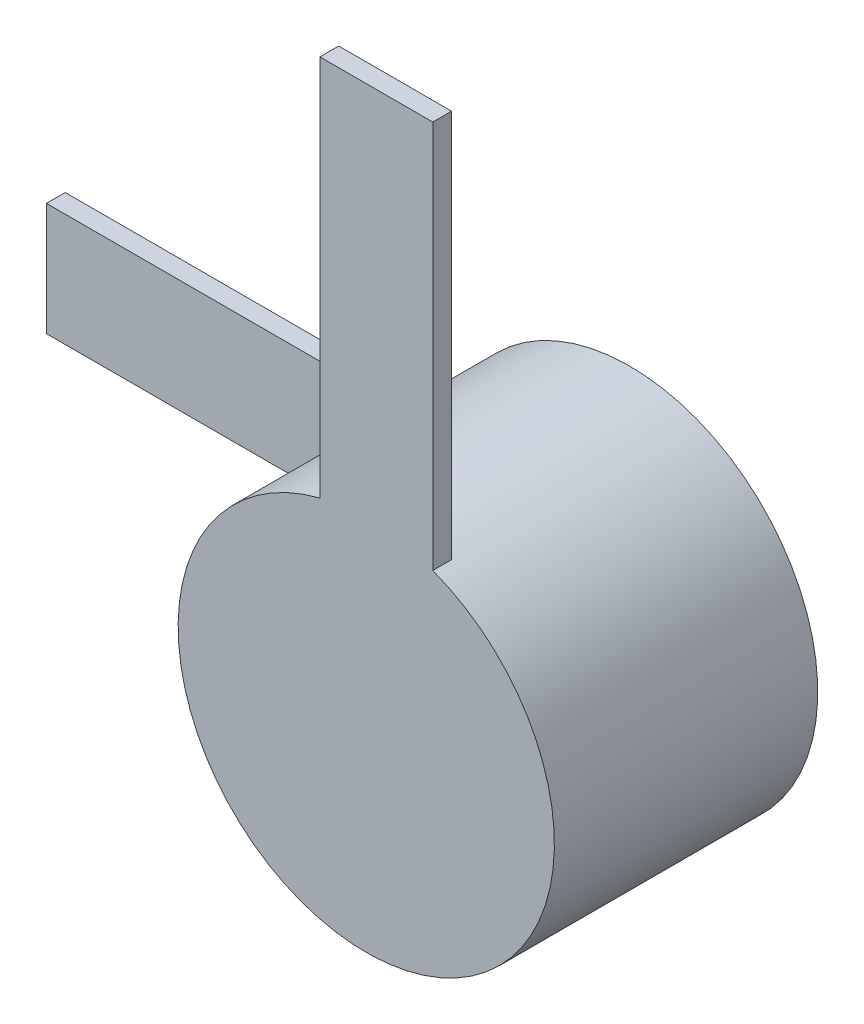
ISO-10303-21;
HEADER;
FILE_DESCRIPTION(('STEP AP214'),'2;1');
FILE_NAME('part.step','',(''),(''),'','','');
FILE_SCHEMA(('AUTOMOTIVE_DESIGN { 1 0 10303 214 1 1 1 1 }'));
ENDSEC;
DATA;
#1=APPLICATION_CONTEXT('core data for automotive mechanical design processes');
#2=APPLICATION_PROTOCOL_DEFINITION('international standard','automotive_design',2000,#1);
#3=PRODUCT_CONTEXT('',#1,'mechanical');
#4=PRODUCT('Part','Part','',(#3));
#5=PRODUCT_RELATED_PRODUCT_CATEGORY('part','',(#4));
#6=PRODUCT_DEFINITION_FORMATION('','',#4);
#7=PRODUCT_DEFINITION_CONTEXT('part definition',#1,'design');
#8=PRODUCT_DEFINITION('design','',#6,#7);
#9=PRODUCT_DEFINITION_SHAPE('','',#8);
#10=(LENGTH_UNIT() NAMED_UNIT(*) SI_UNIT(.MILLI.,.METRE.));
#11=(NAMED_UNIT(*) PLANE_ANGLE_UNIT() SI_UNIT($,.RADIAN.));
#12=(NAMED_UNIT(*) SI_UNIT($,.STERADIAN.) SOLID_ANGLE_UNIT());
#13=UNCERTAINTY_MEASURE_WITH_UNIT(LENGTH_MEASURE(1.E-05),#10,'distance_accuracy_value','');
#14=(GEOMETRIC_REPRESENTATION_CONTEXT(3) GLOBAL_UNCERTAINTY_ASSIGNED_CONTEXT((#13)) GLOBAL_UNIT_ASSIGNED_CONTEXT((#10,
#11,#12)) REPRESENTATION_CONTEXT('',''));
#15=CARTESIAN_POINT('',(0.,0.,0.));
#16=DIRECTION('',(0.,0.,1.));
#17=DIRECTION('',(1.,0.,0.));
#18=AXIS2_PLACEMENT_3D('',#15,#16,#17);
#19=CARTESIAN_POINT('',(0.,0.,70.));
#20=DIRECTION('',(0.,0.,-1.));
#21=DIRECTION('',(-1.,0.,0.));
#22=AXIS2_PLACEMENT_3D('',#19,#20,#21);
#23=CYLINDRICAL_SURFACE('',#22,50.);
#24=CARTESIAN_POINT('',(0.,0.,5.));
#25=DIRECTION('',(0.,0.,1.));
#26=DIRECTION('',(0.,-1.,0.));
#27=AXIS2_PLACEMENT_3D('',#24,#25,#26);
#28=CIRCLE('',#27,50.);
#29=CARTESIAN_POINT('',(-47.7157659315328,14.9400696640668,5.));
#30=VERTEX_POINT('',#29);
#31=CARTESIAN_POINT('',(-47.678071461384,-15.0599303359332,5.));
#32=VERTEX_POINT('',#31);
#33=EDGE_CURVE('E11',#30,#32,#28,.T.);
#34=ORIENTED_EDGE('',*,*,#33,.T.);
#35=DIRECTION('',(0.,0.,-1.));
#36=VECTOR('',#35,1.);
#37=CARTESIAN_POINT('',(-47.678071461384,-15.0599303359332,70.));
#38=LINE('',#37,#36);
#39=CARTESIAN_POINT('',(-47.678071461384,-15.0599303359332,0.));
#40=VERTEX_POINT('',#39);
#41=EDGE_CURVE('E134',#32,#40,#38,.T.);
#42=ORIENTED_EDGE('',*,*,#41,.T.);
#43=CARTESIAN_POINT('',(0.,0.,0.));
#44=DIRECTION('',(0.,0.,1.));
#45=DIRECTION('',(1.,0.,0.));
#46=AXIS2_PLACEMENT_3D('',#43,#44,#45);
#47=CIRCLE('',#46,50.);
#48=CARTESIAN_POINT('',(-47.7157659315328,14.9400696640668,0.));
#49=VERTEX_POINT('',#48);
#50=EDGE_CURVE('E163',#40,#49,#47,.T.);
#51=ORIENTED_EDGE('',*,*,#50,.T.);
#52=DIRECTION('',(0.,0.,-1.));
#53=VECTOR('',#52,1.);
#54=CARTESIAN_POINT('',(-47.7157659315328,14.9400696640668,70.));
#55=LINE('',#54,#53);
#56=EDGE_CURVE('E105',#49,#30,#55,.F.);
#57=ORIENTED_EDGE('',*,*,#56,.T.);
#58=EDGE_LOOP('',(#34,#42,#51,#57));
#59=FACE_BOUND('',#58,.T.);
#60=DIRECTION('',(0.,0.,-1.));
#61=VECTOR('',#60,1.);
#62=CARTESIAN_POINT('',(-12.3266957170573,48.4567082321848,70.));
#63=LINE('',#62,#61);
#64=CARTESIAN_POINT('',(-12.3266957170573,48.4567082321848,65.));
#65=VERTEX_POINT('',#64);
#66=CARTESIAN_POINT('',(-12.3266957170573,48.4567082321848,70.));
#67=VERTEX_POINT('',#66);
#68=EDGE_CURVE('E160',#65,#67,#63,.F.);
#69=ORIENTED_EDGE('',*,*,#68,.F.);
#70=CARTESIAN_POINT('',(0.,0.,65.));
#71=DIRECTION('',(0.,0.,1.));
#72=DIRECTION('',(1.,0.,0.));
#73=AXIS2_PLACEMENT_3D('',#70,#71,#72);
#74=CIRCLE('',#73,50.);
#75=CARTESIAN_POINT('',(17.6733042829427,46.7723670100468,65.));
#76=VERTEX_POINT('',#75);
#77=EDGE_CURVE('E46',#76,#65,#74,.T.);
#78=ORIENTED_EDGE('',*,*,#77,.F.);
#79=DIRECTION('',(0.,0.,-1.));
#80=VECTOR('',#79,1.);
#81=CARTESIAN_POINT('',(17.6733042829427,46.7723670100468,70.));
#82=LINE('',#81,#80);
#83=CARTESIAN_POINT('',(17.6733042829427,46.7723670100468,70.));
#84=VERTEX_POINT('',#83);
#85=EDGE_CURVE('E158',#84,#76,#82,.T.);
#86=ORIENTED_EDGE('',*,*,#85,.F.);
#87=CARTESIAN_POINT('',(0.,0.,70.));
#88=DIRECTION('',(0.,0.,1.));
#89=DIRECTION('',(1.,0.,0.));
#90=AXIS2_PLACEMENT_3D('',#87,#88,#89);
#91=CIRCLE('',#90,50.);
#92=EDGE_CURVE('E164',#67,#84,#91,.T.);
#93=ORIENTED_EDGE('',*,*,#92,.F.);
#94=EDGE_LOOP('',(#69,#78,#86,#93));
#95=FACE_BOUND('',#94,.T.);
#96=ADVANCED_FACE('F39',(#59,#95),#23,.T.);
#97=CARTESIAN_POINT('',(0.,0.,70.));
#98=DIRECTION('',(0.,0.,1.));
#99=DIRECTION('',(1.,0.,0.));
#100=AXIS2_PLACEMENT_3D('',#97,#98,#99);
#101=PLANE('',#100);
#102=ORIENTED_EDGE('',*,*,#92,.T.);
#103=DIRECTION('',(0.,-1.,0.));
#104=VECTOR('',#103,1.);
#105=CARTESIAN_POINT('',(17.6733042829427,150.,70.));
#106=LINE('',#105,#104);
#107=CARTESIAN_POINT('',(17.6733042829427,150.,70.));
#108=VERTEX_POINT('',#107);
#109=EDGE_CURVE('E152',#108,#84,#106,.T.);
#110=ORIENTED_EDGE('',*,*,#109,.F.);
#111=DIRECTION('',(1.,0.,0.));
#112=VECTOR('',#111,1.);
#113=CARTESIAN_POINT('',(-12.3266957170573,150.,70.));
#114=LINE('',#113,#112);
#115=CARTESIAN_POINT('',(-12.3266957170573,150.,70.));
#116=VERTEX_POINT('',#115);
#117=EDGE_CURVE('E140',#116,#108,#114,.T.);
#118=ORIENTED_EDGE('',*,*,#117,.F.);
#119=DIRECTION('',(0.,-1.,0.));
#120=VECTOR('',#119,1.);
#121=CARTESIAN_POINT('',(-12.3266957170573,150.,70.));
#122=LINE('',#121,#120);
#123=EDGE_CURVE('E155',#116,#67,#122,.T.);
#124=ORIENTED_EDGE('',*,*,#123,.T.);
#125=EDGE_LOOP('',(#102,#110,#118,#124));
#126=FACE_BOUND('',#125,.T.);
#127=ADVANCED_FACE('F183',(#126),#101,.T.);
#128=CARTESIAN_POINT('',(0.,0.,0.));
#129=DIRECTION('',(0.,0.,1.));
#130=DIRECTION('',(1.,0.,0.));
#131=AXIS2_PLACEMENT_3D('',#128,#129,#130);
#132=PLANE('',#131);
#133=ORIENTED_EDGE('',*,*,#50,.F.);
#134=DIRECTION('',(1.,0.,0.));
#135=VECTOR('',#134,1.);
#136=CARTESIAN_POINT('',(-150.,-15.0599303359332,0.));
#137=LINE('',#136,#135);
#138=CARTESIAN_POINT('',(-150.,-15.0599303359332,0.));
#139=VERTEX_POINT('',#138);
#140=EDGE_CURVE('E123',#139,#40,#137,.T.);
#141=ORIENTED_EDGE('',*,*,#140,.F.);
#142=DIRECTION('',(0.,1.,0.));
#143=VECTOR('',#142,1.);
#144=CARTESIAN_POINT('',(-150.,14.9400696640668,0.));
#145=LINE('',#144,#143);
#146=CARTESIAN_POINT('',(-150.,14.9400696640668,0.));
#147=VERTEX_POINT('',#146);
#148=EDGE_CURVE('E117',#139,#147,#145,.T.);
#149=ORIENTED_EDGE('',*,*,#148,.T.);
#150=DIRECTION('',(1.,0.,0.));
#151=VECTOR('',#150,1.);
#152=CARTESIAN_POINT('',(-150.,14.9400696640668,0.));
#153=LINE('',#152,#151);
#154=EDGE_CURVE('E100',#147,#49,#153,.T.);
#155=ORIENTED_EDGE('',*,*,#154,.T.);
#156=EDGE_LOOP('',(#133,#141,#149,#155));
#157=FACE_BOUND('',#156,.T.);
#158=ADVANCED_FACE('F122',(#157),#132,.F.);
#159=CARTESIAN_POINT('',(-12.3266957170573,150.,70.));
#160=DIRECTION('',(1.,0.,0.));
#161=DIRECTION('',(0.,0.,-1.));
#162=AXIS2_PLACEMENT_3D('',#159,#160,#161);
#163=PLANE('',#162);
#164=DIRECTION('',(0.,-1.,0.));
#165=VECTOR('',#164,1.);
#166=CARTESIAN_POINT('',(-12.3266957170573,150.,65.));
#167=LINE('',#166,#165);
#168=CARTESIAN_POINT('',(-12.3266957170573,150.,65.));
#169=VERTEX_POINT('',#168);
#170=EDGE_CURVE('E146',#169,#65,#167,.T.);
#171=ORIENTED_EDGE('',*,*,#170,.T.);
#172=ORIENTED_EDGE('',*,*,#68,.T.);
#173=ORIENTED_EDGE('',*,*,#123,.F.);
#174=DIRECTION('',(0.,0.,1.));
#175=VECTOR('',#174,1.);
#176=CARTESIAN_POINT('',(-12.3266957170573,150.,70.));
#177=LINE('',#176,#175);
#178=EDGE_CURVE('E137',#169,#116,#177,.T.);
#179=ORIENTED_EDGE('',*,*,#178,.F.);
#180=EDGE_LOOP('',(#171,#172,#173,#179));
#181=FACE_BOUND('',#180,.T.);
#182=ADVANCED_FACE('F174',(#181),#163,.F.);
#183=CARTESIAN_POINT('',(17.6733042829427,150.,70.));
#184=DIRECTION('',(-1.,0.,0.));
#185=DIRECTION('',(0.,0.,1.));
#186=AXIS2_PLACEMENT_3D('',#183,#184,#185);
#187=PLANE('',#186);
#188=ORIENTED_EDGE('',*,*,#109,.T.);
#189=ORIENTED_EDGE('',*,*,#85,.T.);
#190=DIRECTION('',(0.,-1.,0.));
#191=VECTOR('',#190,1.);
#192=CARTESIAN_POINT('',(17.6733042829427,150.,65.));
#193=LINE('',#192,#191);
#194=CARTESIAN_POINT('',(17.6733042829427,150.,65.));
#195=VERTEX_POINT('',#194);
#196=EDGE_CURVE('E149',#195,#76,#193,.T.);
#197=ORIENTED_EDGE('',*,*,#196,.F.);
#198=DIRECTION('',(0.,0.,-1.));
#199=VECTOR('',#198,1.);
#200=CARTESIAN_POINT('',(17.6733042829427,150.,70.));
#201=LINE('',#200,#199);
#202=EDGE_CURVE('E142',#108,#195,#201,.T.);
#203=ORIENTED_EDGE('',*,*,#202,.F.);
#204=EDGE_LOOP('',(#188,#189,#197,#203));
#205=FACE_BOUND('',#204,.T.);
#206=ADVANCED_FACE('F181',(#205),#187,.F.);
#207=CARTESIAN_POINT('',(-12.3266957170573,150.,65.));
#208=DIRECTION('',(0.,0.,1.));
#209=DIRECTION('',(1.,0.,0.));
#210=AXIS2_PLACEMENT_3D('',#207,#208,#209);
#211=PLANE('',#210);
#212=ORIENTED_EDGE('',*,*,#196,.T.);
#213=ORIENTED_EDGE('',*,*,#77,.T.);
#214=ORIENTED_EDGE('',*,*,#170,.F.);
#215=DIRECTION('',(-1.,0.,0.));
#216=VECTOR('',#215,1.);
#217=CARTESIAN_POINT('',(-12.3266957170573,150.,65.));
#218=LINE('',#217,#216);
#219=EDGE_CURVE('E144',#195,#169,#218,.T.);
#220=ORIENTED_EDGE('',*,*,#219,.F.);
#221=EDGE_LOOP('',(#212,#213,#214,#220));
#222=FACE_BOUND('',#221,.T.);
#223=ADVANCED_FACE('F169',(#222),#211,.F.);
#224=CARTESIAN_POINT('',(0.,150.,0.));
#225=DIRECTION('',(0.,-1.,0.));
#226=DIRECTION('',(0.,0.,-1.));
#227=AXIS2_PLACEMENT_3D('',#224,#225,#226);
#228=PLANE('',#227);
#229=ORIENTED_EDGE('',*,*,#178,.T.);
#230=ORIENTED_EDGE('',*,*,#117,.T.);
#231=ORIENTED_EDGE('',*,*,#202,.T.);
#232=ORIENTED_EDGE('',*,*,#219,.T.);
#233=EDGE_LOOP('',(#229,#230,#231,#232));
#234=FACE_BOUND('',#233,.T.);
#235=ADVANCED_FACE('F177',(#234),#228,.F.);
#236=CARTESIAN_POINT('',(-150.,-15.0599303359332,0.));
#237=DIRECTION('',(0.,-1.,0.));
#238=DIRECTION('',(0.,0.,-1.));
#239=AXIS2_PLACEMENT_3D('',#236,#237,#238);
#240=PLANE('',#239);
#241=ORIENTED_EDGE('',*,*,#41,.F.);
#242=DIRECTION('',(1.,0.,0.));
#243=VECTOR('',#242,1.);
#244=CARTESIAN_POINT('',(-150.,-15.0599303359332,5.));
#245=LINE('',#244,#243);
#246=CARTESIAN_POINT('',(-150.,-15.0599303359332,5.));
#247=VERTEX_POINT('',#246);
#248=EDGE_CURVE('E129',#247,#32,#245,.T.);
#249=ORIENTED_EDGE('',*,*,#248,.F.);
#250=DIRECTION('',(0.,0.,-1.));
#251=VECTOR('',#250,1.);
#252=CARTESIAN_POINT('',(-150.,-15.0599303359332,0.));
#253=LINE('',#252,#251);
#254=EDGE_CURVE('E110',#247,#139,#253,.T.);
#255=ORIENTED_EDGE('',*,*,#254,.T.);
#256=ORIENTED_EDGE('',*,*,#140,.T.);
#257=EDGE_LOOP('',(#241,#249,#255,#256));
#258=FACE_BOUND('',#257,.T.);
#259=ADVANCED_FACE('F200',(#258),#240,.T.);
#260=CARTESIAN_POINT('',(-150.,14.9400696640668,0.));
#261=DIRECTION('',(0.,1.,0.));
#262=DIRECTION('',(0.,0.,1.));
#263=AXIS2_PLACEMENT_3D('',#260,#261,#262);
#264=PLANE('',#263);
#265=ORIENTED_EDGE('',*,*,#56,.F.);
#266=ORIENTED_EDGE('',*,*,#154,.F.);
#267=DIRECTION('',(0.,0.,1.));
#268=VECTOR('',#267,1.);
#269=CARTESIAN_POINT('',(-150.,14.9400696640668,0.));
#270=LINE('',#269,#268);
#271=CARTESIAN_POINT('',(-150.,14.9400696640668,5.));
#272=VERTEX_POINT('',#271);
#273=EDGE_CURVE('E103',#147,#272,#270,.T.);
#274=ORIENTED_EDGE('',*,*,#273,.T.);
#275=DIRECTION('',(1.,0.,0.));
#276=VECTOR('',#275,1.);
#277=CARTESIAN_POINT('',(-150.,14.9400696640668,5.));
#278=LINE('',#277,#276);
#279=EDGE_CURVE('E53',#272,#30,#278,.T.);
#280=ORIENTED_EDGE('',*,*,#279,.T.);
#281=EDGE_LOOP('',(#265,#266,#274,#280));
#282=FACE_BOUND('',#281,.T.);
#283=ADVANCED_FACE('F102',(#282),#264,.T.);
#284=CARTESIAN_POINT('',(-150.,14.9400696640668,5.));
#285=DIRECTION('',(0.,0.,1.));
#286=DIRECTION('',(0.,-1.,0.));
#287=AXIS2_PLACEMENT_3D('',#284,#285,#286);
#288=PLANE('',#287);
#289=ORIENTED_EDGE('',*,*,#33,.F.);
#290=ORIENTED_EDGE('',*,*,#279,.F.);
#291=DIRECTION('',(0.,-1.,0.));
#292=VECTOR('',#291,1.);
#293=CARTESIAN_POINT('',(-150.,14.9400696640668,5.));
#294=LINE('',#293,#292);
#295=EDGE_CURVE('E120',#272,#247,#294,.T.);
#296=ORIENTED_EDGE('',*,*,#295,.T.);
#297=ORIENTED_EDGE('',*,*,#248,.T.);
#298=EDGE_LOOP('',(#289,#290,#296,#297));
#299=FACE_BOUND('',#298,.T.);
#300=ADVANCED_FACE('F203',(#299),#288,.T.);
#301=CARTESIAN_POINT('',(-150.,0.,0.));
#302=DIRECTION('',(-1.,0.,0.));
#303=DIRECTION('',(0.,0.,1.));
#304=AXIS2_PLACEMENT_3D('',#301,#302,#303);
#305=PLANE('',#304);
#306=ORIENTED_EDGE('',*,*,#148,.F.);
#307=ORIENTED_EDGE('',*,*,#254,.F.);
#308=ORIENTED_EDGE('',*,*,#295,.F.);
#309=ORIENTED_EDGE('',*,*,#273,.F.);
#310=EDGE_LOOP('',(#306,#307,#308,#309));
#311=FACE_BOUND('',#310,.T.);
#312=ADVANCED_FACE('F115',(#311),#305,.T.);
#313=CLOSED_SHELL('',(#96,#127,#158,#182,#206,#223,#235,#259,#283,#300,#312));
#314=MANIFOLD_SOLID_BREP('B2',#313);
#315=ADVANCED_BREP_SHAPE_REPRESENTATION('',(#18,#314),#14);
#316=SHAPE_DEFINITION_REPRESENTATION(#9,#315);
ENDSEC;
END-ISO-10303-21;
